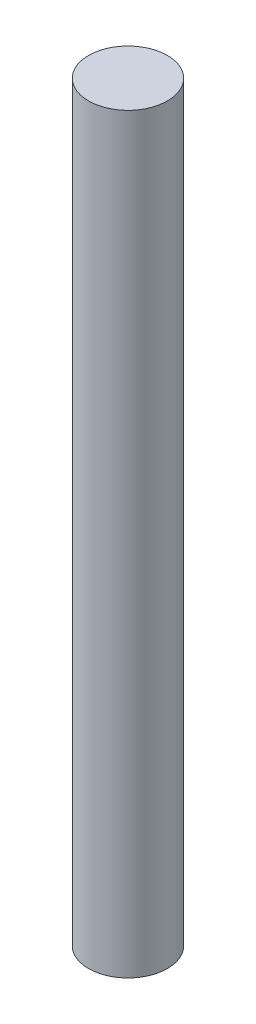
ISO-10303-21;
HEADER;
FILE_DESCRIPTION(('STEP AP214'),'2;1');
FILE_NAME('part.step','',(''),(''),'','','');
FILE_SCHEMA(('AUTOMOTIVE_DESIGN { 1 0 10303 214 1 1 1 1 }'));
ENDSEC;
DATA;
#1=APPLICATION_CONTEXT('core data for automotive mechanical design processes');
#2=APPLICATION_PROTOCOL_DEFINITION('international standard','automotive_design',2000,#1);
#3=PRODUCT_CONTEXT('',#1,'mechanical');
#4=PRODUCT('Part','Part','',(#3));
#5=PRODUCT_RELATED_PRODUCT_CATEGORY('part','',(#4));
#6=PRODUCT_DEFINITION_FORMATION('','',#4);
#7=PRODUCT_DEFINITION_CONTEXT('part definition',#1,'design');
#8=PRODUCT_DEFINITION('design','',#6,#7);
#9=PRODUCT_DEFINITION_SHAPE('','',#8);
#10=(LENGTH_UNIT() NAMED_UNIT(*) SI_UNIT(.MILLI.,.METRE.));
#11=(NAMED_UNIT(*) PLANE_ANGLE_UNIT() SI_UNIT($,.RADIAN.));
#12=(NAMED_UNIT(*) SI_UNIT($,.STERADIAN.) SOLID_ANGLE_UNIT());
#13=UNCERTAINTY_MEASURE_WITH_UNIT(LENGTH_MEASURE(1.E-05),#10,'distance_accuracy_value','');
#14=(GEOMETRIC_REPRESENTATION_CONTEXT(3) GLOBAL_UNCERTAINTY_ASSIGNED_CONTEXT((#13)) GLOBAL_UNIT_ASSIGNED_CONTEXT((#10,
#11,#12)) REPRESENTATION_CONTEXT('',''));
#15=CARTESIAN_POINT('',(0.,0.,0.));
#16=DIRECTION('',(0.,0.,1.));
#17=DIRECTION('',(1.,0.,0.));
#18=AXIS2_PLACEMENT_3D('',#15,#16,#17);
#19=CARTESIAN_POINT('',(0.,143.,0.));
#20=DIRECTION('',(0.,-1.,0.));
#21=DIRECTION('',(0.,0.,-1.));
#22=AXIS2_PLACEMENT_3D('',#19,#20,#21);
#23=CYLINDRICAL_SURFACE('',#22,7.5);
#24=CARTESIAN_POINT('',(0.,143.,0.));
#25=DIRECTION('',(0.,1.,0.));
#26=DIRECTION('',(0.,0.,1.));
#27=AXIS2_PLACEMENT_3D('',#24,#25,#26);
#28=CIRCLE('',#27,7.5);
#29=CARTESIAN_POINT('',(0.,143.,7.5));
#30=VERTEX_POINT('',#29);
#31=EDGE_CURVE('E10',#30,#30,#28,.T.);
#32=ORIENTED_EDGE('',*,*,#31,.F.);
#33=EDGE_LOOP('',(#32));
#34=FACE_BOUND('',#33,.T.);
#35=CARTESIAN_POINT('',(0.,0.,0.));
#36=DIRECTION('',(0.,1.,0.));
#37=DIRECTION('',(0.,0.,1.));
#38=AXIS2_PLACEMENT_3D('',#35,#36,#37);
#39=CIRCLE('',#38,7.5);
#40=CARTESIAN_POINT('',(0.,0.,7.5));
#41=VERTEX_POINT('',#40);
#42=EDGE_CURVE('E40',#41,#41,#39,.T.);
#43=ORIENTED_EDGE('',*,*,#42,.T.);
#44=EDGE_LOOP('',(#43));
#45=FACE_BOUND('',#44,.T.);
#46=ADVANCED_FACE('F37',(#34,#45),#23,.T.);
#47=CARTESIAN_POINT('',(0.,143.,0.));
#48=DIRECTION('',(0.,1.,0.));
#49=DIRECTION('',(0.,0.,1.));
#50=AXIS2_PLACEMENT_3D('',#47,#48,#49);
#51=PLANE('',#50);
#52=ORIENTED_EDGE('',*,*,#31,.T.);
#53=EDGE_LOOP('',(#52));
#54=FACE_BOUND('',#53,.T.);
#55=ADVANCED_FACE('F54',(#54),#51,.T.);
#56=CARTESIAN_POINT('',(0.,0.,0.));
#57=DIRECTION('',(0.,1.,0.));
#58=DIRECTION('',(0.,0.,1.));
#59=AXIS2_PLACEMENT_3D('',#56,#57,#58);
#60=PLANE('',#59);
#61=ORIENTED_EDGE('',*,*,#42,.F.);
#62=EDGE_LOOP('',(#61));
#63=FACE_BOUND('',#62,.T.);
#64=ADVANCED_FACE('F52',(#63),#60,.F.);
#65=CLOSED_SHELL('',(#46,#55,#64));
#66=MANIFOLD_SOLID_BREP('B2',#65);
#67=ADVANCED_BREP_SHAPE_REPRESENTATION('',(#18,#66),#14);
#68=SHAPE_DEFINITION_REPRESENTATION(#9,#67);
ENDSEC;
END-ISO-10303-21;
